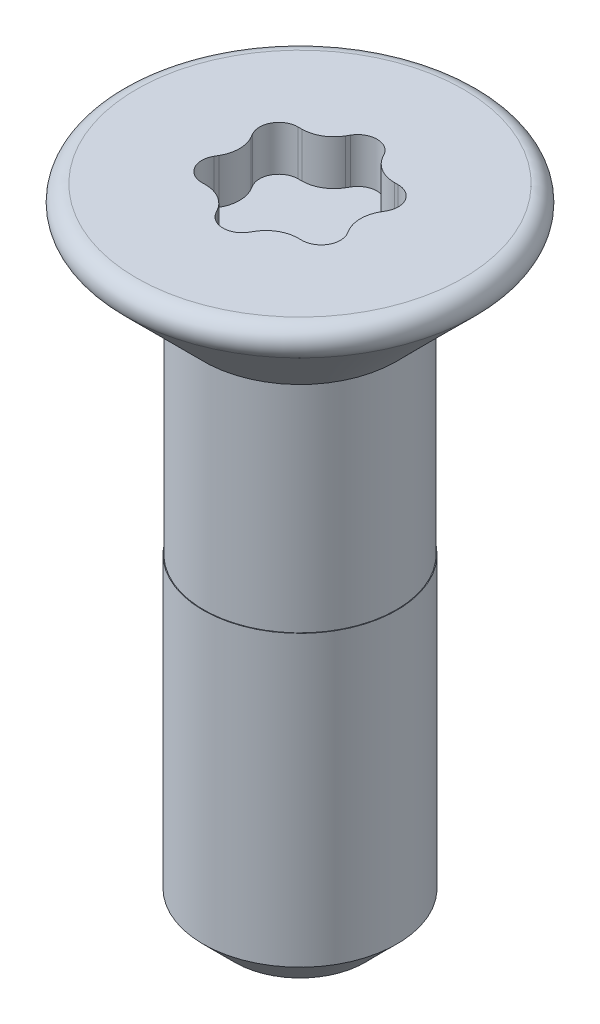
ISO-10303-21;
HEADER;
FILE_DESCRIPTION(('STEP AP214'),'2;1');
FILE_NAME('part.step','',(''),(''),'','','');
FILE_SCHEMA(('AUTOMOTIVE_DESIGN { 1 0 10303 214 1 1 1 1 }'));
ENDSEC;
DATA;
#1=APPLICATION_CONTEXT('core data for automotive mechanical design processes');
#2=APPLICATION_PROTOCOL_DEFINITION('international standard','automotive_design',2000,#1);
#3=PRODUCT_CONTEXT('',#1,'mechanical');
#4=PRODUCT('Part','Part','',(#3));
#5=PRODUCT_RELATED_PRODUCT_CATEGORY('part','',(#4));
#6=PRODUCT_DEFINITION_FORMATION('','',#4);
#7=PRODUCT_DEFINITION_CONTEXT('part definition',#1,'design');
#8=PRODUCT_DEFINITION('design','',#6,#7);
#9=PRODUCT_DEFINITION_SHAPE('','',#8);
#10=(LENGTH_UNIT() NAMED_UNIT(*) SI_UNIT(.MILLI.,.METRE.));
#11=(NAMED_UNIT(*) PLANE_ANGLE_UNIT() SI_UNIT($,.RADIAN.));
#12=(NAMED_UNIT(*) SI_UNIT($,.STERADIAN.) SOLID_ANGLE_UNIT());
#13=UNCERTAINTY_MEASURE_WITH_UNIT(LENGTH_MEASURE(1.E-05),#10,'distance_accuracy_value','');
#14=(GEOMETRIC_REPRESENTATION_CONTEXT(3) GLOBAL_UNCERTAINTY_ASSIGNED_CONTEXT((#13)) GLOBAL_UNIT_ASSIGNED_CONTEXT((#10,
#11,#12)) REPRESENTATION_CONTEXT('',''));
#15=CARTESIAN_POINT('',(0.,0.,0.));
#16=DIRECTION('',(0.,0.,1.));
#17=DIRECTION('',(1.,0.,0.));
#18=AXIS2_PLACEMENT_3D('',#15,#16,#17);
#19=CARTESIAN_POINT('',(-0.721687836487033,-0.7,-1.25));
#20=DIRECTION('',(0.,1.,0.));
#21=DIRECTION('',(0.,0.,1.));
#22=AXIS2_PLACEMENT_3D('',#19,#20,#21);
#23=PLANE('',#22);
#24=CARTESIAN_POINT('',(0.,-0.7,-0.900000000000001));
#25=DIRECTION('',(0.,1.,0.));
#26=DIRECTION('',(0.,0.,1.));
#27=AXIS2_PLACEMENT_3D('',#24,#25,#26);
#28=CIRCLE('',#27,0.3);
#29=CARTESIAN_POINT('',(0.259807621135331,-0.7,-1.05));
#30=VERTEX_POINT('',#29);
#31=CARTESIAN_POINT('',(-0.259807621135332,-0.7,-1.05));
#32=VERTEX_POINT('',#31);
#33=EDGE_CURVE('E261',#30,#32,#28,.T.);
#34=ORIENTED_EDGE('',*,*,#33,.T.);
#35=DIRECTION('',(0.5,0.,-0.866025403784438));
#36=VECTOR('',#35,1.);
#37=CARTESIAN_POINT('',(-0.288675134594814,-0.7,-1.));
#38=LINE('',#37,#36);
#39=CARTESIAN_POINT('',(-0.288675134594814,-0.7,-1.));
#40=VERTEX_POINT('',#39);
#41=EDGE_CURVE('E263',#40,#32,#38,.T.);
#42=ORIENTED_EDGE('',*,*,#41,.F.);
#43=CARTESIAN_POINT('',(-0.721687836487033,-0.7,-1.25));
#44=DIRECTION('',(0.,1.,0.));
#45=DIRECTION('',(0.,0.,1.));
#46=AXIS2_PLACEMENT_3D('',#43,#44,#45);
#47=CIRCLE('',#46,0.5);
#48=CARTESIAN_POINT('',(-0.721687836487033,-0.7,-0.75));
#49=VERTEX_POINT('',#48);
#50=EDGE_CURVE('E256',#49,#40,#47,.T.);
#51=ORIENTED_EDGE('',*,*,#50,.F.);
#52=DIRECTION('',(1.,0.,0.));
#53=VECTOR('',#52,1.);
#54=CARTESIAN_POINT('',(-0.779422863405995,-0.7,-0.75));
#55=LINE('',#54,#53);
#56=CARTESIAN_POINT('',(-0.779422863405995,-0.7,-0.75));
#57=VERTEX_POINT('',#56);
#58=EDGE_CURVE('E183',#57,#49,#55,.T.);
#59=ORIENTED_EDGE('',*,*,#58,.F.);
#60=CARTESIAN_POINT('',(-0.779422863405995,-0.7,-0.45));
#61=DIRECTION('',(0.,1.,0.));
#62=DIRECTION('',(0.,0.,1.));
#63=AXIS2_PLACEMENT_3D('',#60,#61,#62);
#64=CIRCLE('',#63,0.3);
#65=CARTESIAN_POINT('',(-1.03923048454133,-0.7,-0.3));
#66=VERTEX_POINT('',#65);
#67=EDGE_CURVE('E186',#57,#66,#64,.T.);
#68=ORIENTED_EDGE('',*,*,#67,.T.);
#69=DIRECTION('',(-0.500000000000001,0.,-0.866025403784438));
#70=VECTOR('',#69,1.);
#71=CARTESIAN_POINT('',(-1.01036297108185,-0.7,-0.25));
#72=LINE('',#71,#70);
#73=CARTESIAN_POINT('',(-1.01036297108185,-0.7,-0.25));
#74=VERTEX_POINT('',#73);
#75=EDGE_CURVE('E189',#74,#66,#72,.T.);
#76=ORIENTED_EDGE('',*,*,#75,.F.);
#77=CARTESIAN_POINT('',(-1.44337567297407,-0.7,0.));
#78=DIRECTION('',(0.,1.,0.));
#79=DIRECTION('',(0.,0.,1.));
#80=AXIS2_PLACEMENT_3D('',#77,#78,#79);
#81=CIRCLE('',#80,0.5);
#82=CARTESIAN_POINT('',(-1.01036297108185,-0.7,0.249999999999999));
#83=VERTEX_POINT('',#82);
#84=EDGE_CURVE('E202',#83,#74,#81,.T.);
#85=ORIENTED_EDGE('',*,*,#84,.F.);
#86=DIRECTION('',(0.499999999999995,0.,-0.866025403784441));
#87=VECTOR('',#86,1.);
#88=CARTESIAN_POINT('',(-1.03923048454133,-0.7,0.300000000000001));
#89=LINE('',#88,#87);
#90=CARTESIAN_POINT('',(-1.03923048454133,-0.7,0.300000000000001));
#91=VERTEX_POINT('',#90);
#92=EDGE_CURVE('E210',#91,#83,#89,.T.);
#93=ORIENTED_EDGE('',*,*,#92,.F.);
#94=CARTESIAN_POINT('',(-0.779422863405996,-0.7,0.450000000000001));
#95=DIRECTION('',(0.,1.,0.));
#96=DIRECTION('',(0.,0.,1.));
#97=AXIS2_PLACEMENT_3D('',#94,#95,#96);
#98=CIRCLE('',#97,0.3);
#99=CARTESIAN_POINT('',(-0.779422863405997,-0.7,0.75));
#100=VERTEX_POINT('',#99);
#101=EDGE_CURVE('E297',#91,#100,#98,.T.);
#102=ORIENTED_EDGE('',*,*,#101,.T.);
#103=DIRECTION('',(-1.,0.,0.));
#104=VECTOR('',#103,1.);
#105=CARTESIAN_POINT('',(-0.721687836487033,-0.7,0.750000000000001));
#106=LINE('',#105,#104);
#107=CARTESIAN_POINT('',(-0.721687836487031,-0.7,0.750000000000001));
#108=VERTEX_POINT('',#107);
#109=EDGE_CURVE('E299',#108,#100,#106,.T.);
#110=ORIENTED_EDGE('',*,*,#109,.F.);
#111=CARTESIAN_POINT('',(-0.721687836487033,-0.7,1.25));
#112=DIRECTION('',(0.,1.,0.));
#113=DIRECTION('',(0.,0.,1.));
#114=AXIS2_PLACEMENT_3D('',#111,#112,#113);
#115=CIRCLE('',#114,0.5);
#116=CARTESIAN_POINT('',(-0.288675134594814,-0.7,1.));
#117=VERTEX_POINT('',#116);
#118=EDGE_CURVE('E292',#117,#108,#115,.T.);
#119=ORIENTED_EDGE('',*,*,#118,.F.);
#120=DIRECTION('',(-0.500000000000002,0.,-0.866025403784438));
#121=VECTOR('',#120,1.);
#122=CARTESIAN_POINT('',(-0.259807621135332,-0.7,1.05));
#123=LINE('',#122,#121);
#124=CARTESIAN_POINT('',(-0.259807621135331,-0.7,1.05));
#125=VERTEX_POINT('',#124);
#126=EDGE_CURVE('E752',#125,#117,#123,.T.);
#127=ORIENTED_EDGE('',*,*,#126,.F.);
#128=CARTESIAN_POINT('',(0.,-0.7,0.900000000000001));
#129=DIRECTION('',(0.,1.,0.));
#130=DIRECTION('',(0.,0.,1.));
#131=AXIS2_PLACEMENT_3D('',#128,#129,#130);
#132=CIRCLE('',#131,0.3);
#133=CARTESIAN_POINT('',(0.259807621135332,-0.7,1.05));
#134=VERTEX_POINT('',#133);
#135=EDGE_CURVE('E288',#125,#134,#132,.T.);
#136=ORIENTED_EDGE('',*,*,#135,.T.);
#137=DIRECTION('',(-0.499999999999999,0.,0.866025403784439));
#138=VECTOR('',#137,1.);
#139=CARTESIAN_POINT('',(0.288675134594813,-0.7,1.));
#140=LINE('',#139,#138);
#141=CARTESIAN_POINT('',(0.288675134594813,-0.7,1.));
#142=VERTEX_POINT('',#141);
#143=EDGE_CURVE('E290',#142,#134,#140,.T.);
#144=ORIENTED_EDGE('',*,*,#143,.F.);
#145=CARTESIAN_POINT('',(0.721687836487033,-0.7,1.25));
#146=DIRECTION('',(0.,1.,0.));
#147=DIRECTION('',(0.,0.,1.));
#148=AXIS2_PLACEMENT_3D('',#145,#146,#147);
#149=CIRCLE('',#148,0.5);
#150=CARTESIAN_POINT('',(0.721687836487032,-0.7,0.750000000000001));
#151=VERTEX_POINT('',#150);
#152=EDGE_CURVE('E283',#151,#142,#149,.T.);
#153=ORIENTED_EDGE('',*,*,#152,.F.);
#154=DIRECTION('',(-1.,0.,0.));
#155=VECTOR('',#154,1.);
#156=CARTESIAN_POINT('',(0.779422863405995,-0.7,0.750000000000001));
#157=LINE('',#156,#155);
#158=CARTESIAN_POINT('',(0.779422863405995,-0.7,0.750000000000001));
#159=VERTEX_POINT('',#158);
#160=EDGE_CURVE('E742',#159,#151,#157,.T.);
#161=ORIENTED_EDGE('',*,*,#160,.F.);
#162=CARTESIAN_POINT('',(0.779422863405995,-0.7,0.450000000000001));
#163=DIRECTION('',(0.,1.,0.));
#164=DIRECTION('',(0.,0.,1.));
#165=AXIS2_PLACEMENT_3D('',#162,#163,#164);
#166=CIRCLE('',#165,0.3);
#167=CARTESIAN_POINT('',(1.03923048454133,-0.7,0.300000000000001));
#168=VERTEX_POINT('',#167);
#169=EDGE_CURVE('E279',#159,#168,#166,.T.);
#170=ORIENTED_EDGE('',*,*,#169,.T.);
#171=DIRECTION('',(0.499999999999997,0.,0.866025403784441));
#172=VECTOR('',#171,1.);
#173=CARTESIAN_POINT('',(1.01036297108185,-0.7,0.250000000000001));
#174=LINE('',#173,#172);
#175=CARTESIAN_POINT('',(1.01036297108185,-0.7,0.25));
#176=VERTEX_POINT('',#175);
#177=EDGE_CURVE('E281',#176,#168,#174,.T.);
#178=ORIENTED_EDGE('',*,*,#177,.F.);
#179=CARTESIAN_POINT('',(1.44337567297406,-0.7,0.));
#180=DIRECTION('',(0.,1.,0.));
#181=DIRECTION('',(0.,0.,1.));
#182=AXIS2_PLACEMENT_3D('',#179,#180,#181);
#183=CIRCLE('',#182,0.5);
#184=CARTESIAN_POINT('',(1.01036297108185,-0.7,-0.25));
#185=VERTEX_POINT('',#184);
#186=EDGE_CURVE('E274',#185,#176,#183,.T.);
#187=ORIENTED_EDGE('',*,*,#186,.F.);
#188=DIRECTION('',(-0.500000000000003,0.,0.866025403784437));
#189=VECTOR('',#188,1.);
#190=CARTESIAN_POINT('',(1.03923048454133,-0.7,-0.3));
#191=LINE('',#190,#189);
#192=CARTESIAN_POINT('',(1.03923048454133,-0.7,-0.299999999999999));
#193=VERTEX_POINT('',#192);
#194=EDGE_CURVE('E732',#193,#185,#191,.T.);
#195=ORIENTED_EDGE('',*,*,#194,.F.);
#196=CARTESIAN_POINT('',(0.779422863405996,-0.7,-0.45));
#197=DIRECTION('',(0.,1.,0.));
#198=DIRECTION('',(0.,0.,1.));
#199=AXIS2_PLACEMENT_3D('',#196,#197,#198);
#200=CIRCLE('',#199,0.3);
#201=CARTESIAN_POINT('',(0.779422863405996,-0.7,-0.749999999999999));
#202=VERTEX_POINT('',#201);
#203=EDGE_CURVE('E270',#193,#202,#200,.T.);
#204=ORIENTED_EDGE('',*,*,#203,.T.);
#205=DIRECTION('',(1.,0.,0.));
#206=VECTOR('',#205,1.);
#207=CARTESIAN_POINT('',(0.721687836487033,-0.7,-0.749999999999999));
#208=LINE('',#207,#206);
#209=CARTESIAN_POINT('',(0.721687836487033,-0.7,-0.75));
#210=VERTEX_POINT('',#209);
#211=EDGE_CURVE('E272',#210,#202,#208,.T.);
#212=ORIENTED_EDGE('',*,*,#211,.F.);
#213=CARTESIAN_POINT('',(0.721687836487033,-0.7,-1.25));
#214=DIRECTION('',(0.,1.,0.));
#215=DIRECTION('',(0.,0.,1.));
#216=AXIS2_PLACEMENT_3D('',#213,#214,#215);
#217=CIRCLE('',#216,0.5);
#218=CARTESIAN_POINT('',(0.288675134594814,-0.7,-0.999999999999999));
#219=VERTEX_POINT('',#218);
#220=EDGE_CURVE('E265',#219,#210,#217,.T.);
#221=ORIENTED_EDGE('',*,*,#220,.F.);
#222=DIRECTION('',(0.500000000000004,0.,0.866025403784436));
#223=VECTOR('',#222,1.);
#224=CARTESIAN_POINT('',(0.259807621135331,-0.7,-1.05));
#225=LINE('',#224,#223);
#226=EDGE_CURVE('E722',#30,#219,#225,.T.);
#227=ORIENTED_EDGE('',*,*,#226,.F.);
#228=EDGE_LOOP('',(#34,#42,#51,#59,#68,#76,#85,#93,#102,#110,#119,#127,#136,#144,#153,#161,#170,
#178,#187,#195,#204,#212,#221,#227));
#229=FACE_BOUND('',#228,.T.);
#230=ADVANCED_FACE('F17',(#229),#23,.T.);
#231=CARTESIAN_POINT('',(-0.779422863405995,-0.7,-0.75));
#232=DIRECTION('',(0.,0.,1.));
#233=DIRECTION('',(1.,0.,0.));
#234=AXIS2_PLACEMENT_3D('',#231,#232,#233);
#235=PLANE('',#234);
#236=ORIENTED_EDGE('',*,*,#58,.T.);
#237=DIRECTION('',(0.,1.,0.));
#238=VECTOR('',#237,1.);
#239=CARTESIAN_POINT('',(-0.721687836487033,-0.7,-0.75));
#240=LINE('',#239,#238);
#241=CARTESIAN_POINT('',(-0.721687836487033,0.,-0.75));
#242=VERTEX_POINT('',#241);
#243=EDGE_CURVE('E260',#242,#49,#240,.F.);
#244=ORIENTED_EDGE('',*,*,#243,.F.);
#245=DIRECTION('',(1.,0.,0.));
#246=VECTOR('',#245,1.);
#247=CARTESIAN_POINT('',(0.,0.,-0.75));
#248=LINE('',#247,#246);
#249=CARTESIAN_POINT('',(-0.779422863405995,0.,-0.75));
#250=VERTEX_POINT('',#249);
#251=EDGE_CURVE('E255',#242,#250,#248,.F.);
#252=ORIENTED_EDGE('',*,*,#251,.T.);
#253=DIRECTION('',(0.,1.,0.));
#254=VECTOR('',#253,1.);
#255=CARTESIAN_POINT('',(-0.779422863405995,-0.7,-0.75));
#256=LINE('',#255,#254);
#257=EDGE_CURVE('E193',#250,#57,#256,.F.);
#258=ORIENTED_EDGE('',*,*,#257,.T.);
#259=EDGE_LOOP('',(#236,#244,#252,#258));
#260=FACE_BOUND('',#259,.T.);
#261=ADVANCED_FACE('F418',(#260),#235,.T.);
#262=CARTESIAN_POINT('',(-0.779422863405995,-0.7,-0.45));
#263=DIRECTION('',(0.,1.,0.));
#264=DIRECTION('',(0.,0.,1.));
#265=AXIS2_PLACEMENT_3D('',#262,#263,#264);
#266=CYLINDRICAL_SURFACE('',#265,0.3);
#267=DIRECTION('',(0.,1.,0.));
#268=VECTOR('',#267,1.);
#269=CARTESIAN_POINT('',(-1.03923048454133,-0.7,-0.3));
#270=LINE('',#269,#268);
#271=CARTESIAN_POINT('',(-1.03923048454133,0.,-0.3));
#272=VERTEX_POINT('',#271);
#273=EDGE_CURVE('E196',#66,#272,#270,.T.);
#274=ORIENTED_EDGE('',*,*,#273,.F.);
#275=ORIENTED_EDGE('',*,*,#67,.F.);
#276=ORIENTED_EDGE('',*,*,#257,.F.);
#277=CARTESIAN_POINT('',(-0.779422863405995,0.,-0.45));
#278=DIRECTION('',(0.,1.,0.));
#279=DIRECTION('',(0.,0.,1.));
#280=AXIS2_PLACEMENT_3D('',#277,#278,#279);
#281=CIRCLE('',#280,0.3);
#282=EDGE_CURVE('E199',#250,#272,#281,.T.);
#283=ORIENTED_EDGE('',*,*,#282,.T.);
#284=EDGE_LOOP('',(#274,#275,#276,#283));
#285=FACE_BOUND('',#284,.T.);
#286=ADVANCED_FACE('F197',(#285),#266,.F.);
#287=CARTESIAN_POINT('',(-1.01036297108185,-0.7,-0.25));
#288=DIRECTION('',(0.866025403784438,0.,-0.500000000000001));
#289=DIRECTION('',(-0.500000000000001,0.,-0.866025403784438));
#290=AXIS2_PLACEMENT_3D('',#287,#288,#289);
#291=PLANE('',#290);
#292=ORIENTED_EDGE('',*,*,#75,.T.);
#293=ORIENTED_EDGE('',*,*,#273,.T.);
#294=DIRECTION('',(0.499999999999999,0.,0.866025403784439));
#295=VECTOR('',#294,1.);
#296=CARTESIAN_POINT('',(-1.03923048454133,0.,-0.3));
#297=LINE('',#296,#295);
#298=CARTESIAN_POINT('',(-1.01036297108185,0.,-0.249999999999999));
#299=VERTEX_POINT('',#298);
#300=EDGE_CURVE('E253',#272,#299,#297,.T.);
#301=ORIENTED_EDGE('',*,*,#300,.T.);
#302=DIRECTION('',(0.,1.,0.));
#303=VECTOR('',#302,1.);
#304=CARTESIAN_POINT('',(-1.01036297108185,-0.7,-0.25));
#305=LINE('',#304,#303);
#306=EDGE_CURVE('E206',#74,#299,#305,.T.);
#307=ORIENTED_EDGE('',*,*,#306,.F.);
#308=EDGE_LOOP('',(#292,#293,#301,#307));
#309=FACE_BOUND('',#308,.T.);
#310=ADVANCED_FACE('F204',(#309),#291,.T.);
#311=CARTESIAN_POINT('',(-1.44337567297407,-0.7,0.));
#312=DIRECTION('',(0.,1.,0.));
#313=DIRECTION('',(0.,0.,1.));
#314=AXIS2_PLACEMENT_3D('',#311,#312,#313);
#315=CYLINDRICAL_SURFACE('',#314,0.5);
#316=ORIENTED_EDGE('',*,*,#84,.T.);
#317=ORIENTED_EDGE('',*,*,#306,.T.);
#318=CARTESIAN_POINT('',(-1.44337567297407,0.,0.));
#319=DIRECTION('',(0.,1.,0.));
#320=DIRECTION('',(0.,0.,1.));
#321=AXIS2_PLACEMENT_3D('',#318,#319,#320);
#322=CIRCLE('',#321,0.5);
#323=CARTESIAN_POINT('',(-1.01036297108185,0.,0.249999999999999));
#324=VERTEX_POINT('',#323);
#325=EDGE_CURVE('E251',#299,#324,#322,.F.);
#326=ORIENTED_EDGE('',*,*,#325,.T.);
#327=DIRECTION('',(0.,1.,0.));
#328=VECTOR('',#327,1.);
#329=CARTESIAN_POINT('',(-1.01036297108185,-0.7,0.25));
#330=LINE('',#329,#328);
#331=EDGE_CURVE('E759',#83,#324,#330,.T.);
#332=ORIENTED_EDGE('',*,*,#331,.F.);
#333=EDGE_LOOP('',(#316,#317,#326,#332));
#334=FACE_BOUND('',#333,.T.);
#335=ADVANCED_FACE('F410',(#334),#315,.T.);
#336=CARTESIAN_POINT('',(-1.03923048454133,-0.7,0.300000000000001));
#337=DIRECTION('',(0.866025403784441,0.,0.499999999999995));
#338=DIRECTION('',(0.499999999999995,0.,-0.866025403784441));
#339=AXIS2_PLACEMENT_3D('',#336,#337,#338);
#340=PLANE('',#339);
#341=ORIENTED_EDGE('',*,*,#92,.T.);
#342=ORIENTED_EDGE('',*,*,#331,.T.);
#343=DIRECTION('',(-0.499999999999995,0.,0.866025403784441));
#344=VECTOR('',#343,1.);
#345=CARTESIAN_POINT('',(-1.01036297108185,0.,0.25));
#346=LINE('',#345,#344);
#347=CARTESIAN_POINT('',(-1.03923048454133,0.,0.300000000000001));
#348=VERTEX_POINT('',#347);
#349=EDGE_CURVE('E250',#324,#348,#346,.T.);
#350=ORIENTED_EDGE('',*,*,#349,.T.);
#351=DIRECTION('',(0.,1.,0.));
#352=VECTOR('',#351,1.);
#353=CARTESIAN_POINT('',(-1.03923048454133,-0.7,0.300000000000001));
#354=LINE('',#353,#352);
#355=EDGE_CURVE('E300',#348,#91,#354,.F.);
#356=ORIENTED_EDGE('',*,*,#355,.T.);
#357=EDGE_LOOP('',(#341,#342,#350,#356));
#358=FACE_BOUND('',#357,.T.);
#359=ADVANCED_FACE('F406',(#358),#340,.T.);
#360=CARTESIAN_POINT('',(-0.779422863405996,-0.7,0.450000000000001));
#361=DIRECTION('',(0.,1.,0.));
#362=DIRECTION('',(0.,0.,1.));
#363=AXIS2_PLACEMENT_3D('',#360,#361,#362);
#364=CYLINDRICAL_SURFACE('',#363,0.3);
#365=DIRECTION('',(0.,1.,0.));
#366=VECTOR('',#365,1.);
#367=CARTESIAN_POINT('',(-0.779422863405996,-0.7,0.75));
#368=LINE('',#367,#366);
#369=CARTESIAN_POINT('',(-0.779422863405996,0.,0.75));
#370=VERTEX_POINT('',#369);
#371=EDGE_CURVE('E296',#100,#370,#368,.T.);
#372=ORIENTED_EDGE('',*,*,#371,.F.);
#373=ORIENTED_EDGE('',*,*,#101,.F.);
#374=ORIENTED_EDGE('',*,*,#355,.F.);
#375=CARTESIAN_POINT('',(-0.779422863405996,0.,0.450000000000001));
#376=DIRECTION('',(0.,1.,0.));
#377=DIRECTION('',(0.,0.,1.));
#378=AXIS2_PLACEMENT_3D('',#375,#376,#377);
#379=CIRCLE('',#378,0.3);
#380=EDGE_CURVE('E248',#348,#370,#379,.T.);
#381=ORIENTED_EDGE('',*,*,#380,.T.);
#382=EDGE_LOOP('',(#372,#373,#374,#381));
#383=FACE_BOUND('',#382,.T.);
#384=ADVANCED_FACE('F402',(#383),#364,.F.);
#385=CARTESIAN_POINT('',(-0.721687836487033,-0.7,0.750000000000001));
#386=DIRECTION('',(0.,0.,-1.));
#387=DIRECTION('',(-1.,0.,0.));
#388=AXIS2_PLACEMENT_3D('',#385,#386,#387);
#389=PLANE('',#388);
#390=ORIENTED_EDGE('',*,*,#109,.T.);
#391=ORIENTED_EDGE('',*,*,#371,.T.);
#392=DIRECTION('',(1.,0.,0.));
#393=VECTOR('',#392,1.);
#394=CARTESIAN_POINT('',(0.,0.,0.75));
#395=LINE('',#394,#393);
#396=CARTESIAN_POINT('',(-0.721687836487033,0.,0.75));
#397=VERTEX_POINT('',#396);
#398=EDGE_CURVE('E247',#370,#397,#395,.T.);
#399=ORIENTED_EDGE('',*,*,#398,.T.);
#400=DIRECTION('',(0.,1.,0.));
#401=VECTOR('',#400,1.);
#402=CARTESIAN_POINT('',(-0.721687836487033,-0.7,0.750000000000001));
#403=LINE('',#402,#401);
#404=EDGE_CURVE('E295',#108,#397,#403,.T.);
#405=ORIENTED_EDGE('',*,*,#404,.F.);
#406=EDGE_LOOP('',(#390,#391,#399,#405));
#407=FACE_BOUND('',#406,.T.);
#408=ADVANCED_FACE('F398',(#407),#389,.T.);
#409=CARTESIAN_POINT('',(-0.721687836487033,-0.7,1.25));
#410=DIRECTION('',(0.,1.,0.));
#411=DIRECTION('',(0.,0.,1.));
#412=AXIS2_PLACEMENT_3D('',#409,#410,#411);
#413=CYLINDRICAL_SURFACE('',#412,0.5);
#414=ORIENTED_EDGE('',*,*,#118,.T.);
#415=ORIENTED_EDGE('',*,*,#404,.T.);
#416=CARTESIAN_POINT('',(-0.721687836487033,0.,1.25));
#417=DIRECTION('',(0.,1.,0.));
#418=DIRECTION('',(0.,0.,1.));
#419=AXIS2_PLACEMENT_3D('',#416,#417,#418);
#420=CIRCLE('',#419,0.5);
#421=CARTESIAN_POINT('',(-0.288675134594814,0.,1.));
#422=VERTEX_POINT('',#421);
#423=EDGE_CURVE('E245',#397,#422,#420,.F.);
#424=ORIENTED_EDGE('',*,*,#423,.T.);
#425=DIRECTION('',(0.,1.,0.));
#426=VECTOR('',#425,1.);
#427=CARTESIAN_POINT('',(-0.288675134594813,-0.7,1.));
#428=LINE('',#427,#426);
#429=EDGE_CURVE('E749',#117,#422,#428,.T.);
#430=ORIENTED_EDGE('',*,*,#429,.F.);
#431=EDGE_LOOP('',(#414,#415,#424,#430));
#432=FACE_BOUND('',#431,.T.);
#433=ADVANCED_FACE('F394',(#432),#413,.T.);
#434=CARTESIAN_POINT('',(-0.259807621135332,-0.7,1.05));
#435=DIRECTION('',(0.866025403784438,0.,-0.500000000000002));
#436=DIRECTION('',(-0.500000000000002,0.,-0.866025403784438));
#437=AXIS2_PLACEMENT_3D('',#434,#435,#436);
#438=PLANE('',#437);
#439=ORIENTED_EDGE('',*,*,#126,.T.);
#440=ORIENTED_EDGE('',*,*,#429,.T.);
#441=DIRECTION('',(0.500000000000002,0.,0.866025403784438));
#442=VECTOR('',#441,1.);
#443=CARTESIAN_POINT('',(-0.288675134594813,0.,1.));
#444=LINE('',#443,#442);
#445=CARTESIAN_POINT('',(-0.259807621135331,0.,1.05));
#446=VERTEX_POINT('',#445);
#447=EDGE_CURVE('E244',#422,#446,#444,.T.);
#448=ORIENTED_EDGE('',*,*,#447,.T.);
#449=DIRECTION('',(0.,1.,0.));
#450=VECTOR('',#449,1.);
#451=CARTESIAN_POINT('',(-0.259807621135332,-0.7,1.05));
#452=LINE('',#451,#450);
#453=EDGE_CURVE('E291',#446,#125,#452,.F.);
#454=ORIENTED_EDGE('',*,*,#453,.T.);
#455=EDGE_LOOP('',(#439,#440,#448,#454));
#456=FACE_BOUND('',#455,.T.);
#457=ADVANCED_FACE('F390',(#456),#438,.T.);
#458=CARTESIAN_POINT('',(0.,-0.7,0.900000000000001));
#459=DIRECTION('',(0.,1.,0.));
#460=DIRECTION('',(0.,0.,1.));
#461=AXIS2_PLACEMENT_3D('',#458,#459,#460);
#462=CYLINDRICAL_SURFACE('',#461,0.3);
#463=ORIENTED_EDGE('',*,*,#135,.F.);
#464=ORIENTED_EDGE('',*,*,#453,.F.);
#465=CARTESIAN_POINT('',(0.,0.,0.900000000000001));
#466=DIRECTION('',(0.,1.,0.));
#467=DIRECTION('',(0.,0.,1.));
#468=AXIS2_PLACEMENT_3D('',#465,#466,#467);
#469=CIRCLE('',#468,0.3);
#470=CARTESIAN_POINT('',(0.259807621135332,0.,1.05));
#471=VERTEX_POINT('',#470);
#472=EDGE_CURVE('E242',#446,#471,#469,.T.);
#473=ORIENTED_EDGE('',*,*,#472,.T.);
#474=DIRECTION('',(0.,1.,0.));
#475=VECTOR('',#474,1.);
#476=CARTESIAN_POINT('',(0.259807621135332,-0.7,1.05));
#477=LINE('',#476,#475);
#478=EDGE_CURVE('E287',#134,#471,#477,.T.);
#479=ORIENTED_EDGE('',*,*,#478,.F.);
#480=EDGE_LOOP('',(#463,#464,#473,#479));
#481=FACE_BOUND('',#480,.T.);
#482=ADVANCED_FACE('F386',(#481),#462,.F.);
#483=CARTESIAN_POINT('',(0.288675134594813,-0.7,1.));
#484=DIRECTION('',(-0.866025403784439,0.,-0.499999999999999));
#485=DIRECTION('',(-0.499999999999999,0.,0.866025403784439));
#486=AXIS2_PLACEMENT_3D('',#483,#484,#485);
#487=PLANE('',#486);
#488=ORIENTED_EDGE('',*,*,#143,.T.);
#489=ORIENTED_EDGE('',*,*,#478,.T.);
#490=DIRECTION('',(0.499999999999997,0.,-0.86602540378444));
#491=VECTOR('',#490,1.);
#492=CARTESIAN_POINT('',(0.259807621135332,0.,1.05));
#493=LINE('',#492,#491);
#494=CARTESIAN_POINT('',(0.288675134594813,0.,1.));
#495=VERTEX_POINT('',#494);
#496=EDGE_CURVE('E241',#471,#495,#493,.T.);
#497=ORIENTED_EDGE('',*,*,#496,.T.);
#498=DIRECTION('',(0.,1.,0.));
#499=VECTOR('',#498,1.);
#500=CARTESIAN_POINT('',(0.288675134594814,-0.7,1.));
#501=LINE('',#500,#499);
#502=EDGE_CURVE('E286',#142,#495,#501,.T.);
#503=ORIENTED_EDGE('',*,*,#502,.F.);
#504=EDGE_LOOP('',(#488,#489,#497,#503));
#505=FACE_BOUND('',#504,.T.);
#506=ADVANCED_FACE('F382',(#505),#487,.T.);
#507=CARTESIAN_POINT('',(0.721687836487033,-0.7,1.25));
#508=DIRECTION('',(0.,1.,0.));
#509=DIRECTION('',(0.,0.,1.));
#510=AXIS2_PLACEMENT_3D('',#507,#508,#509);
#511=CYLINDRICAL_SURFACE('',#510,0.5);
#512=ORIENTED_EDGE('',*,*,#152,.T.);
#513=ORIENTED_EDGE('',*,*,#502,.T.);
#514=CARTESIAN_POINT('',(0.721687836487033,0.,1.25));
#515=DIRECTION('',(0.,1.,0.));
#516=DIRECTION('',(0.,0.,1.));
#517=AXIS2_PLACEMENT_3D('',#514,#515,#516);
#518=CIRCLE('',#517,0.5);
#519=CARTESIAN_POINT('',(0.721687836487033,0.,0.750000000000001));
#520=VERTEX_POINT('',#519);
#521=EDGE_CURVE('E239',#495,#520,#518,.F.);
#522=ORIENTED_EDGE('',*,*,#521,.T.);
#523=DIRECTION('',(0.,1.,0.));
#524=VECTOR('',#523,1.);
#525=CARTESIAN_POINT('',(0.721687836487033,-0.7,0.750000000000001));
#526=LINE('',#525,#524);
#527=EDGE_CURVE('E739',#151,#520,#526,.T.);
#528=ORIENTED_EDGE('',*,*,#527,.F.);
#529=EDGE_LOOP('',(#512,#513,#522,#528));
#530=FACE_BOUND('',#529,.T.);
#531=ADVANCED_FACE('F378',(#530),#511,.T.);
#532=CARTESIAN_POINT('',(0.779422863405995,-0.7,0.750000000000001));
#533=DIRECTION('',(0.,0.,-1.));
#534=DIRECTION('',(-1.,0.,0.));
#535=AXIS2_PLACEMENT_3D('',#532,#533,#534);
#536=PLANE('',#535);
#537=ORIENTED_EDGE('',*,*,#160,.T.);
#538=ORIENTED_EDGE('',*,*,#527,.T.);
#539=DIRECTION('',(1.,0.,0.));
#540=VECTOR('',#539,1.);
#541=CARTESIAN_POINT('',(0.,0.,0.750000000000001));
#542=LINE('',#541,#540);
#543=CARTESIAN_POINT('',(0.779422863405995,0.,0.750000000000001));
#544=VERTEX_POINT('',#543);
#545=EDGE_CURVE('E238',#520,#544,#542,.T.);
#546=ORIENTED_EDGE('',*,*,#545,.T.);
#547=DIRECTION('',(0.,1.,0.));
#548=VECTOR('',#547,1.);
#549=CARTESIAN_POINT('',(0.779422863405995,-0.7,0.750000000000001));
#550=LINE('',#549,#548);
#551=EDGE_CURVE('E282',#544,#159,#550,.F.);
#552=ORIENTED_EDGE('',*,*,#551,.T.);
#553=EDGE_LOOP('',(#537,#538,#546,#552));
#554=FACE_BOUND('',#553,.T.);
#555=ADVANCED_FACE('F374',(#554),#536,.T.);
#556=CARTESIAN_POINT('',(0.779422863405995,-0.7,0.450000000000001));
#557=DIRECTION('',(0.,1.,0.));
#558=DIRECTION('',(0.,0.,1.));
#559=AXIS2_PLACEMENT_3D('',#556,#557,#558);
#560=CYLINDRICAL_SURFACE('',#559,0.3);
#561=DIRECTION('',(0.,1.,0.));
#562=VECTOR('',#561,1.);
#563=CARTESIAN_POINT('',(1.03923048454133,-0.7,0.300000000000001));
#564=LINE('',#563,#562);
#565=CARTESIAN_POINT('',(1.03923048454133,0.,0.300000000000001));
#566=VERTEX_POINT('',#565);
#567=EDGE_CURVE('E278',#168,#566,#564,.T.);
#568=ORIENTED_EDGE('',*,*,#567,.F.);
#569=ORIENTED_EDGE('',*,*,#169,.F.);
#570=ORIENTED_EDGE('',*,*,#551,.F.);
#571=CARTESIAN_POINT('',(0.779422863405995,0.,0.450000000000001));
#572=DIRECTION('',(0.,1.,0.));
#573=DIRECTION('',(0.,0.,1.));
#574=AXIS2_PLACEMENT_3D('',#571,#572,#573);
#575=CIRCLE('',#574,0.3);
#576=EDGE_CURVE('E236',#544,#566,#575,.T.);
#577=ORIENTED_EDGE('',*,*,#576,.T.);
#578=EDGE_LOOP('',(#568,#569,#570,#577));
#579=FACE_BOUND('',#578,.T.);
#580=ADVANCED_FACE('F370',(#579),#560,.F.);
#581=CARTESIAN_POINT('',(1.01036297108185,-0.7,0.250000000000001));
#582=DIRECTION('',(-0.866025403784441,0.,0.499999999999997));
#583=DIRECTION('',(0.499999999999997,0.,0.866025403784441));
#584=AXIS2_PLACEMENT_3D('',#581,#582,#583);
#585=PLANE('',#584);
#586=ORIENTED_EDGE('',*,*,#177,.T.);
#587=ORIENTED_EDGE('',*,*,#567,.T.);
#588=DIRECTION('',(-0.499999999999996,0.,-0.866025403784441));
#589=VECTOR('',#588,1.);
#590=CARTESIAN_POINT('',(1.03923048454133,0.,0.300000000000001));
#591=LINE('',#590,#589);
#592=CARTESIAN_POINT('',(1.01036297108185,0.,0.249999999999999));
#593=VERTEX_POINT('',#592);
#594=EDGE_CURVE('E235',#566,#593,#591,.T.);
#595=ORIENTED_EDGE('',*,*,#594,.T.);
#596=DIRECTION('',(0.,1.,0.));
#597=VECTOR('',#596,1.);
#598=CARTESIAN_POINT('',(1.01036297108185,-0.7,0.25));
#599=LINE('',#598,#597);
#600=EDGE_CURVE('E277',#176,#593,#599,.T.);
#601=ORIENTED_EDGE('',*,*,#600,.F.);
#602=EDGE_LOOP('',(#586,#587,#595,#601));
#603=FACE_BOUND('',#602,.T.);
#604=ADVANCED_FACE('F366',(#603),#585,.T.);
#605=CARTESIAN_POINT('',(1.44337567297406,-0.7,0.));
#606=DIRECTION('',(0.,1.,0.));
#607=DIRECTION('',(0.,0.,1.));
#608=AXIS2_PLACEMENT_3D('',#605,#606,#607);
#609=CYLINDRICAL_SURFACE('',#608,0.5);
#610=ORIENTED_EDGE('',*,*,#186,.T.);
#611=ORIENTED_EDGE('',*,*,#600,.T.);
#612=CARTESIAN_POINT('',(1.44337567297406,0.,0.));
#613=DIRECTION('',(0.,1.,0.));
#614=DIRECTION('',(0.,0.,1.));
#615=AXIS2_PLACEMENT_3D('',#612,#613,#614);
#616=CIRCLE('',#615,0.5);
#617=CARTESIAN_POINT('',(1.01036297108185,0.,-0.249999999999999));
#618=VERTEX_POINT('',#617);
#619=EDGE_CURVE('E233',#593,#618,#616,.F.);
#620=ORIENTED_EDGE('',*,*,#619,.T.);
#621=DIRECTION('',(0.,1.,0.));
#622=VECTOR('',#621,1.);
#623=CARTESIAN_POINT('',(1.01036297108185,-0.7,-0.249999999999999));
#624=LINE('',#623,#622);
#625=EDGE_CURVE('E729',#185,#618,#624,.T.);
#626=ORIENTED_EDGE('',*,*,#625,.F.);
#627=EDGE_LOOP('',(#610,#611,#620,#626));
#628=FACE_BOUND('',#627,.T.);
#629=ADVANCED_FACE('F362',(#628),#609,.T.);
#630=CARTESIAN_POINT('',(1.03923048454133,-0.7,-0.3));
#631=DIRECTION('',(-0.866025403784437,0.,-0.500000000000003));
#632=DIRECTION('',(-0.500000000000003,0.,0.866025403784437));
#633=AXIS2_PLACEMENT_3D('',#630,#631,#632);
#634=PLANE('',#633);
#635=ORIENTED_EDGE('',*,*,#194,.T.);
#636=ORIENTED_EDGE('',*,*,#625,.T.);
#637=DIRECTION('',(0.499999999999997,0.,-0.866025403784441));
#638=VECTOR('',#637,1.);
#639=CARTESIAN_POINT('',(1.01036297108185,0.,-0.249999999999999));
#640=LINE('',#639,#638);
#641=CARTESIAN_POINT('',(1.03923048454133,0.,-0.3));
#642=VERTEX_POINT('',#641);
#643=EDGE_CURVE('E232',#618,#642,#640,.T.);
#644=ORIENTED_EDGE('',*,*,#643,.T.);
#645=DIRECTION('',(0.,1.,0.));
#646=VECTOR('',#645,1.);
#647=CARTESIAN_POINT('',(1.03923048454133,-0.7,-0.3));
#648=LINE('',#647,#646);
#649=EDGE_CURVE('E273',#642,#193,#648,.F.);
#650=ORIENTED_EDGE('',*,*,#649,.T.);
#651=EDGE_LOOP('',(#635,#636,#644,#650));
#652=FACE_BOUND('',#651,.T.);
#653=ADVANCED_FACE('F358',(#652),#634,.T.);
#654=CARTESIAN_POINT('',(0.779422863405996,-0.7,-0.45));
#655=DIRECTION('',(0.,1.,0.));
#656=DIRECTION('',(0.,0.,1.));
#657=AXIS2_PLACEMENT_3D('',#654,#655,#656);
#658=CYLINDRICAL_SURFACE('',#657,0.3);
#659=DIRECTION('',(0.,1.,0.));
#660=VECTOR('',#659,1.);
#661=CARTESIAN_POINT('',(0.779422863405996,-0.7,-0.749999999999999));
#662=LINE('',#661,#660);
#663=CARTESIAN_POINT('',(0.779422863405996,0.,-0.75));
#664=VERTEX_POINT('',#663);
#665=EDGE_CURVE('E269',#202,#664,#662,.T.);
#666=ORIENTED_EDGE('',*,*,#665,.F.);
#667=ORIENTED_EDGE('',*,*,#203,.F.);
#668=ORIENTED_EDGE('',*,*,#649,.F.);
#669=CARTESIAN_POINT('',(0.779422863405996,0.,-0.45));
#670=DIRECTION('',(0.,1.,0.));
#671=DIRECTION('',(0.,0.,1.));
#672=AXIS2_PLACEMENT_3D('',#669,#670,#671);
#673=CIRCLE('',#672,0.3);
#674=EDGE_CURVE('E230',#642,#664,#673,.T.);
#675=ORIENTED_EDGE('',*,*,#674,.T.);
#676=EDGE_LOOP('',(#666,#667,#668,#675));
#677=FACE_BOUND('',#676,.T.);
#678=ADVANCED_FACE('F354',(#677),#658,.F.);
#679=CARTESIAN_POINT('',(0.721687836487033,-0.7,-0.749999999999999));
#680=DIRECTION('',(0.,0.,1.));
#681=DIRECTION('',(1.,0.,0.));
#682=AXIS2_PLACEMENT_3D('',#679,#680,#681);
#683=PLANE('',#682);
#684=ORIENTED_EDGE('',*,*,#211,.T.);
#685=ORIENTED_EDGE('',*,*,#665,.T.);
#686=DIRECTION('',(1.,0.,0.));
#687=VECTOR('',#686,1.);
#688=CARTESIAN_POINT('',(0.,0.,-0.75));
#689=LINE('',#688,#687);
#690=CARTESIAN_POINT('',(0.721687836487033,0.,-0.75));
#691=VERTEX_POINT('',#690);
#692=EDGE_CURVE('E229',#664,#691,#689,.F.);
#693=ORIENTED_EDGE('',*,*,#692,.T.);
#694=DIRECTION('',(0.,1.,0.));
#695=VECTOR('',#694,1.);
#696=CARTESIAN_POINT('',(0.721687836487033,-0.7,-0.75));
#697=LINE('',#696,#695);
#698=EDGE_CURVE('E268',#210,#691,#697,.T.);
#699=ORIENTED_EDGE('',*,*,#698,.F.);
#700=EDGE_LOOP('',(#684,#685,#693,#699));
#701=FACE_BOUND('',#700,.T.);
#702=ADVANCED_FACE('F350',(#701),#683,.T.);
#703=CARTESIAN_POINT('',(0.721687836487033,-0.7,-1.25));
#704=DIRECTION('',(0.,1.,0.));
#705=DIRECTION('',(0.,0.,1.));
#706=AXIS2_PLACEMENT_3D('',#703,#704,#705);
#707=CYLINDRICAL_SURFACE('',#706,0.5);
#708=ORIENTED_EDGE('',*,*,#220,.T.);
#709=ORIENTED_EDGE('',*,*,#698,.T.);
#710=CARTESIAN_POINT('',(0.721687836487033,0.,-1.25));
#711=DIRECTION('',(0.,1.,0.));
#712=DIRECTION('',(0.,0.,1.));
#713=AXIS2_PLACEMENT_3D('',#710,#711,#712);
#714=CIRCLE('',#713,0.5);
#715=CARTESIAN_POINT('',(0.288675134594814,0.,-0.999999999999999));
#716=VERTEX_POINT('',#715);
#717=EDGE_CURVE('E227',#691,#716,#714,.F.);
#718=ORIENTED_EDGE('',*,*,#717,.T.);
#719=DIRECTION('',(0.,1.,0.));
#720=VECTOR('',#719,1.);
#721=CARTESIAN_POINT('',(0.288675134594813,-0.7,-1.));
#722=LINE('',#721,#720);
#723=EDGE_CURVE('E719',#219,#716,#722,.T.);
#724=ORIENTED_EDGE('',*,*,#723,.F.);
#725=EDGE_LOOP('',(#708,#709,#718,#724));
#726=FACE_BOUND('',#725,.T.);
#727=ADVANCED_FACE('F346',(#726),#707,.T.);
#728=CARTESIAN_POINT('',(0.259807621135331,-0.7,-1.05));
#729=DIRECTION('',(-0.866025403784436,0.,0.500000000000004));
#730=DIRECTION('',(0.500000000000004,0.,0.866025403784436));
#731=AXIS2_PLACEMENT_3D('',#728,#729,#730);
#732=PLANE('',#731);
#733=ORIENTED_EDGE('',*,*,#226,.T.);
#734=ORIENTED_EDGE('',*,*,#723,.T.);
#735=DIRECTION('',(-0.500000000000003,0.,-0.866025403784437));
#736=VECTOR('',#735,1.);
#737=CARTESIAN_POINT('',(0.288675134594813,0.,-1.));
#738=LINE('',#737,#736);
#739=CARTESIAN_POINT('',(0.259807621135331,0.,-1.05));
#740=VERTEX_POINT('',#739);
#741=EDGE_CURVE('E226',#716,#740,#738,.T.);
#742=ORIENTED_EDGE('',*,*,#741,.T.);
#743=DIRECTION('',(0.,1.,0.));
#744=VECTOR('',#743,1.);
#745=CARTESIAN_POINT('',(0.259807621135331,-0.7,-1.05));
#746=LINE('',#745,#744);
#747=EDGE_CURVE('E264',#740,#30,#746,.F.);
#748=ORIENTED_EDGE('',*,*,#747,.T.);
#749=EDGE_LOOP('',(#733,#734,#742,#748));
#750=FACE_BOUND('',#749,.T.);
#751=ADVANCED_FACE('F342',(#750),#732,.T.);
#752=CARTESIAN_POINT('',(0.,-0.7,-0.900000000000001));
#753=DIRECTION('',(0.,1.,0.));
#754=DIRECTION('',(0.,0.,1.));
#755=AXIS2_PLACEMENT_3D('',#752,#753,#754);
#756=CYLINDRICAL_SURFACE('',#755,0.3);
#757=DIRECTION('',(0.,1.,0.));
#758=VECTOR('',#757,1.);
#759=CARTESIAN_POINT('',(-0.259807621135332,-0.7,-1.05));
#760=LINE('',#759,#758);
#761=CARTESIAN_POINT('',(-0.259807621135332,0.,-1.05));
#762=VERTEX_POINT('',#761);
#763=EDGE_CURVE('E710',#32,#762,#760,.T.);
#764=ORIENTED_EDGE('',*,*,#763,.F.);
#765=ORIENTED_EDGE('',*,*,#33,.F.);
#766=ORIENTED_EDGE('',*,*,#747,.F.);
#767=CARTESIAN_POINT('',(0.,0.,-0.900000000000001));
#768=DIRECTION('',(0.,1.,0.));
#769=DIRECTION('',(0.,0.,1.));
#770=AXIS2_PLACEMENT_3D('',#767,#768,#769);
#771=CIRCLE('',#770,0.3);
#772=EDGE_CURVE('E224',#740,#762,#771,.T.);
#773=ORIENTED_EDGE('',*,*,#772,.T.);
#774=EDGE_LOOP('',(#764,#765,#766,#773));
#775=FACE_BOUND('',#774,.T.);
#776=ADVANCED_FACE('F338',(#775),#756,.F.);
#777=CARTESIAN_POINT('',(-0.288675134594814,-0.7,-1.));
#778=DIRECTION('',(0.866025403784438,0.,0.5));
#779=DIRECTION('',(0.5,0.,-0.866025403784438));
#780=AXIS2_PLACEMENT_3D('',#777,#778,#779);
#781=PLANE('',#780);
#782=ORIENTED_EDGE('',*,*,#41,.T.);
#783=ORIENTED_EDGE('',*,*,#763,.T.);
#784=DIRECTION('',(-0.500000000000001,0.,0.866025403784438));
#785=VECTOR('',#784,1.);
#786=CARTESIAN_POINT('',(-0.259807621135332,0.,-1.05));
#787=LINE('',#786,#785);
#788=CARTESIAN_POINT('',(-0.288675134594814,0.,-0.999999999999999));
#789=VERTEX_POINT('',#788);
#790=EDGE_CURVE('E223',#762,#789,#787,.T.);
#791=ORIENTED_EDGE('',*,*,#790,.T.);
#792=DIRECTION('',(0.,1.,0.));
#793=VECTOR('',#792,1.);
#794=CARTESIAN_POINT('',(-0.288675134594814,-0.7,-1.));
#795=LINE('',#794,#793);
#796=EDGE_CURVE('E259',#40,#789,#795,.T.);
#797=ORIENTED_EDGE('',*,*,#796,.F.);
#798=EDGE_LOOP('',(#782,#783,#791,#797));
#799=FACE_BOUND('',#798,.T.);
#800=ADVANCED_FACE('F334',(#799),#781,.T.);
#801=CARTESIAN_POINT('',(-0.721687836487033,-0.7,-1.25));
#802=DIRECTION('',(0.,1.,0.));
#803=DIRECTION('',(0.,0.,1.));
#804=AXIS2_PLACEMENT_3D('',#801,#802,#803);
#805=CYLINDRICAL_SURFACE('',#804,0.5);
#806=ORIENTED_EDGE('',*,*,#50,.T.);
#807=ORIENTED_EDGE('',*,*,#796,.T.);
#808=CARTESIAN_POINT('',(-0.721687836487033,0.,-1.25));
#809=DIRECTION('',(0.,1.,0.));
#810=DIRECTION('',(0.,0.,1.));
#811=AXIS2_PLACEMENT_3D('',#808,#809,#810);
#812=CIRCLE('',#811,0.5);
#813=EDGE_CURVE('E220',#789,#242,#812,.F.);
#814=ORIENTED_EDGE('',*,*,#813,.T.);
#815=ORIENTED_EDGE('',*,*,#243,.T.);
#816=EDGE_LOOP('',(#806,#807,#814,#815));
#817=FACE_BOUND('',#816,.T.);
#818=ADVANCED_FACE('F326',(#817),#805,.T.);
#819=CARTESIAN_POINT('',(0.,0.,0.));
#820=DIRECTION('',(0.,-1.,0.));
#821=DIRECTION('',(0.,0.,-1.));
#822=AXIS2_PLACEMENT_3D('',#819,#820,#821);
#823=PLANE('',#822);
#824=ORIENTED_EDGE('',*,*,#790,.F.);
#825=ORIENTED_EDGE('',*,*,#772,.F.);
#826=ORIENTED_EDGE('',*,*,#741,.F.);
#827=ORIENTED_EDGE('',*,*,#717,.F.);
#828=ORIENTED_EDGE('',*,*,#692,.F.);
#829=ORIENTED_EDGE('',*,*,#674,.F.);
#830=ORIENTED_EDGE('',*,*,#643,.F.);
#831=ORIENTED_EDGE('',*,*,#619,.F.);
#832=ORIENTED_EDGE('',*,*,#594,.F.);
#833=ORIENTED_EDGE('',*,*,#576,.F.);
#834=ORIENTED_EDGE('',*,*,#545,.F.);
#835=ORIENTED_EDGE('',*,*,#521,.F.);
#836=ORIENTED_EDGE('',*,*,#496,.F.);
#837=ORIENTED_EDGE('',*,*,#472,.F.);
#838=ORIENTED_EDGE('',*,*,#447,.F.);
#839=ORIENTED_EDGE('',*,*,#423,.F.);
#840=ORIENTED_EDGE('',*,*,#398,.F.);
#841=ORIENTED_EDGE('',*,*,#380,.F.);
#842=ORIENTED_EDGE('',*,*,#349,.F.);
#843=ORIENTED_EDGE('',*,*,#325,.F.);
#844=ORIENTED_EDGE('',*,*,#300,.F.);
#845=ORIENTED_EDGE('',*,*,#282,.F.);
#846=ORIENTED_EDGE('',*,*,#251,.F.);
#847=ORIENTED_EDGE('',*,*,#813,.F.);
#848=EDGE_LOOP('',(#824,#825,#826,#827,#828,#829,#830,#831,#832,#833,#834,#835,#836,#837,#838,
#839,#840,#841,#842,#843,#844,#845,#846,#847));
#849=FACE_BOUND('',#848,.T.);
#850=CARTESIAN_POINT('',(0.,0.,0.));
#851=DIRECTION('',(0.,-1.,0.));
#852=DIRECTION('',(0.,0.,-1.));
#853=AXIS2_PLACEMENT_3D('',#850,#851,#852);
#854=CIRCLE('',#853,2.54644660940672);
#855=CARTESIAN_POINT('',(0.,0.,-2.54644660940672));
#856=VERTEX_POINT('',#855);
#857=CARTESIAN_POINT('',(0.,0.,2.54644660940672));
#858=VERTEX_POINT('',#857);
#859=EDGE_CURVE('E36',#856,#858,#854,.T.);
#860=ORIENTED_EDGE('',*,*,#859,.F.);
#861=CARTESIAN_POINT('',(0.,0.,0.));
#862=DIRECTION('',(0.,-1.,0.));
#863=DIRECTION('',(0.,0.,1.));
#864=AXIS2_PLACEMENT_3D('',#861,#862,#863);
#865=CIRCLE('',#864,2.54644660940672);
#866=EDGE_CURVE('E304',#858,#856,#865,.T.);
#867=ORIENTED_EDGE('',*,*,#866,.F.);
#868=EDGE_LOOP('',(#860,#867));
#869=FACE_BOUND('',#868,.T.);
#870=ADVANCED_FACE('F307',(#849,#869),#823,.F.);
#871=CARTESIAN_POINT('',(0.,-0.25,0.));
#872=DIRECTION('',(0.,-1.,0.));
#873=DIRECTION('',(0.,0.,-1.));
#874=AXIS2_PLACEMENT_3D('',#871,#872,#873);
#875=TOROIDAL_SURFACE('',#874,2.54644660940672,0.25);
#876=ORIENTED_EDGE('',*,*,#859,.T.);
#877=ORIENTED_EDGE('',*,*,#866,.T.);
#878=EDGE_LOOP('',(#876,#877));
#879=FACE_BOUND('',#878,.T.);
#880=CARTESIAN_POINT('',(0.,-0.426776695348963,0.));
#881=DIRECTION('',(0.,1.,0.));
#882=DIRECTION('',(0.,0.,1.));
#883=AXIS2_PLACEMENT_3D('',#880,#881,#882);
#884=CIRCLE('',#883,2.72322330471297);
#885=CARTESIAN_POINT('',(0.,-0.426776695348963,2.72322330471297));
#886=VERTEX_POINT('',#885);
#887=EDGE_CURVE('E308',#886,#886,#884,.F.);
#888=ORIENTED_EDGE('',*,*,#887,.F.);
#889=EDGE_LOOP('',(#888));
#890=FACE_BOUND('',#889,.T.);
#891=ADVANCED_FACE('F302',(#879,#890),#875,.T.);
#892=CARTESIAN_POINT('',(0.,-0.426776695405806,0.));
#893=DIRECTION('',(0.,1.,0.));
#894=DIRECTION('',(-1.,0.,0.));
#895=AXIS2_PLACEMENT_3D('',#892,#893,#894);
#896=CONICAL_SURFACE('',#895,2.72322330459929,0.785398163397448);
#897=CARTESIAN_POINT('',(0.,-1.65,0.));
#898=DIRECTION('',(0.,1.,0.));
#899=DIRECTION('',(-1.,0.,0.));
#900=AXIS2_PLACEMENT_3D('',#897,#898,#899);
#901=CIRCLE('',#900,1.5);
#902=CARTESIAN_POINT('',(-1.5,-1.65,0.));
#903=VERTEX_POINT('',#902);
#904=EDGE_CURVE('E219',#903,#903,#901,.F.);
#905=ORIENTED_EDGE('',*,*,#904,.F.);
#906=EDGE_LOOP('',(#905));
#907=FACE_BOUND('',#906,.T.);
#908=ORIENTED_EDGE('',*,*,#887,.T.);
#909=EDGE_LOOP('',(#908));
#910=FACE_BOUND('',#909,.T.);
#911=ADVANCED_FACE('F447',(#907,#910),#896,.T.);
#912=CARTESIAN_POINT('',(0.,-10.,0.));
#913=DIRECTION('',(0.,-1.,0.));
#914=DIRECTION('',(1.,0.,0.));
#915=AXIS2_PLACEMENT_3D('',#912,#913,#914);
#916=PLANE('',#915);
#917=CARTESIAN_POINT('',(0.,-9.99999999993406,0.));
#918=DIRECTION('',(0.,1.,0.));
#919=DIRECTION('',(0.,0.,1.));
#920=AXIS2_PLACEMENT_3D('',#917,#918,#919);
#921=CIRCLE('',#920,1.01414213560247);
#922=CARTESIAN_POINT('',(0.,-9.99999999993406,1.01414213560247));
#923=VERTEX_POINT('',#922);
#924=EDGE_CURVE('E216',#923,#923,#921,.T.);
#925=ORIENTED_EDGE('',*,*,#924,.F.);
#926=EDGE_LOOP('',(#925));
#927=FACE_BOUND('',#926,.T.);
#928=ADVANCED_FACE('F444',(#927),#916,.T.);
#929=CARTESIAN_POINT('',(0.,-1.65,0.));
#930=DIRECTION('',(0.,1.,0.));
#931=DIRECTION('',(-1.,0.,0.));
#932=AXIS2_PLACEMENT_3D('',#929,#930,#931);
#933=CYLINDRICAL_SURFACE('',#932,1.5);
#934=ORIENTED_EDGE('',*,*,#904,.T.);
#935=EDGE_LOOP('',(#934));
#936=FACE_BOUND('',#935,.T.);
#937=CARTESIAN_POINT('',(0.,-5.,0.));
#938=DIRECTION('',(0.,1.,0.));
#939=DIRECTION('',(-1.,0.,0.));
#940=AXIS2_PLACEMENT_3D('',#937,#938,#939);
#941=CIRCLE('',#940,1.5);
#942=CARTESIAN_POINT('',(-1.5,-5.,0.));
#943=VERTEX_POINT('',#942);
#944=EDGE_CURVE('E213',#943,#943,#941,.F.);
#945=ORIENTED_EDGE('',*,*,#944,.F.);
#946=EDGE_LOOP('',(#945));
#947=FACE_BOUND('',#946,.T.);
#948=ADVANCED_FACE('F440',(#936,#947),#933,.T.);
#949=CARTESIAN_POINT('',(0.,-9.50414213554041,0.));
#950=DIRECTION('',(0.,1.,0.));
#951=DIRECTION('',(0.,0.,1.));
#952=AXIS2_PLACEMENT_3D('',#949,#950,#951);
#953=CONICAL_SURFACE('',#952,1.50999999999613,0.785398163397448);
#954=CARTESIAN_POINT('',(0.,-9.50414213562373,0.));
#955=DIRECTION('',(0.,1.,0.));
#956=DIRECTION('',(0.,0.,1.));
#957=AXIS2_PLACEMENT_3D('',#954,#955,#956);
#958=CIRCLE('',#957,1.51);
#959=CARTESIAN_POINT('',(0.,-9.50414213562373,1.51));
#960=VERTEX_POINT('',#959);
#961=EDGE_CURVE('E28',#960,#960,#958,.T.);
#962=ORIENTED_EDGE('',*,*,#961,.F.);
#963=EDGE_LOOP('',(#962));
#964=FACE_BOUND('',#963,.T.);
#965=ORIENTED_EDGE('',*,*,#924,.T.);
#966=EDGE_LOOP('',(#965));
#967=FACE_BOUND('',#966,.T.);
#968=ADVANCED_FACE('F433',(#964,#967),#953,.T.);
#969=CARTESIAN_POINT('',(-1.5,-5.,0.));
#970=DIRECTION('',(0.,1.,0.));
#971=DIRECTION('',(0.,0.,1.));
#972=AXIS2_PLACEMENT_3D('',#969,#970,#971);
#973=PLANE('',#972);
#974=ORIENTED_EDGE('',*,*,#944,.T.);
#975=EDGE_LOOP('',(#974));
#976=FACE_BOUND('',#975,.T.);
#977=CARTESIAN_POINT('',(0.,-5.,0.));
#978=DIRECTION('',(0.,1.,0.));
#979=DIRECTION('',(0.,0.,1.));
#980=AXIS2_PLACEMENT_3D('',#977,#978,#979);
#981=CIRCLE('',#980,1.51);
#982=CARTESIAN_POINT('',(0.,-5.,1.51));
#983=VERTEX_POINT('',#982);
#984=EDGE_CURVE('E11',#983,#983,#981,.F.);
#985=ORIENTED_EDGE('',*,*,#984,.F.);
#986=EDGE_LOOP('',(#985));
#987=FACE_BOUND('',#986,.T.);
#988=ADVANCED_FACE('F427',(#976,#987),#973,.T.);
#989=CARTESIAN_POINT('',(0.,0.,0.));
#990=DIRECTION('',(0.,1.,0.));
#991=DIRECTION('',(0.,0.,1.));
#992=AXIS2_PLACEMENT_3D('',#989,#990,#991);
#993=CYLINDRICAL_SURFACE('',#992,1.51);
#994=ORIENTED_EDGE('',*,*,#984,.T.);
#995=EDGE_LOOP('',(#994));
#996=FACE_BOUND('',#995,.T.);
#997=ORIENTED_EDGE('',*,*,#961,.T.);
#998=EDGE_LOOP('',(#997));
#999=FACE_BOUND('',#998,.T.);
#1000=ADVANCED_FACE('F425',(#996,#999),#993,.T.);
#1001=CLOSED_SHELL('',(#230,#261,#286,#310,#335,#359,#384,#408,#433,#457,#482,#506,#531,#555,
#580,#604,#629,#653,#678,#702,#727,#751,#776,#800,#818,#870,#891,#911,#928,#948,#968,#988,#1000));
#1002=MANIFOLD_SOLID_BREP('B1',#1001);
#1003=ADVANCED_BREP_SHAPE_REPRESENTATION('',(#18,#1002),#14);
#1004=SHAPE_DEFINITION_REPRESENTATION(#9,#1003);
ENDSEC;
END-ISO-10303-21;
